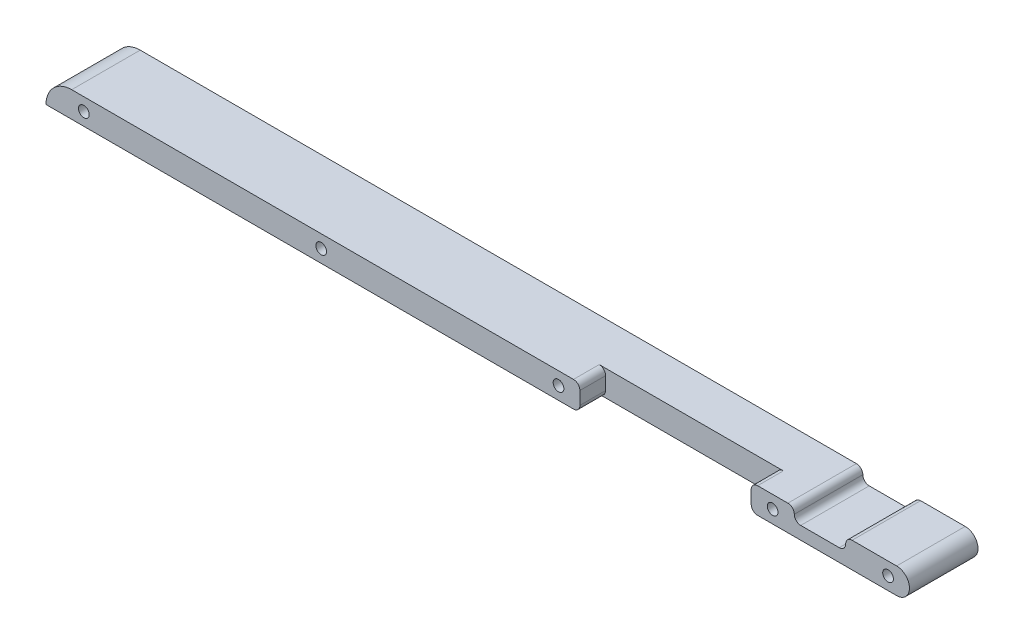
ISO-10303-21;
HEADER;
FILE_DESCRIPTION(('STEP AP214'),'2;1');
FILE_NAME('part.step','',(''),(''),'','','');
FILE_SCHEMA(('AUTOMOTIVE_DESIGN { 1 0 10303 214 1 1 1 1 }'));
ENDSEC;
DATA;
#1=APPLICATION_CONTEXT('core data for automotive mechanical design processes');
#2=APPLICATION_PROTOCOL_DEFINITION('international standard','automotive_design',2000,#1);
#3=PRODUCT_CONTEXT('',#1,'mechanical');
#4=PRODUCT('Part','Part','',(#3));
#5=PRODUCT_RELATED_PRODUCT_CATEGORY('part','',(#4));
#6=PRODUCT_DEFINITION_FORMATION('','',#4);
#7=PRODUCT_DEFINITION_CONTEXT('part definition',#1,'design');
#8=PRODUCT_DEFINITION('design','',#6,#7);
#9=PRODUCT_DEFINITION_SHAPE('','',#8);
#10=(LENGTH_UNIT() NAMED_UNIT(*) SI_UNIT(.MILLI.,.METRE.));
#11=(NAMED_UNIT(*) PLANE_ANGLE_UNIT() SI_UNIT($,.RADIAN.));
#12=(NAMED_UNIT(*) SI_UNIT($,.STERADIAN.) SOLID_ANGLE_UNIT());
#13=UNCERTAINTY_MEASURE_WITH_UNIT(LENGTH_MEASURE(1.E-05),#10,'distance_accuracy_value','');
#14=(GEOMETRIC_REPRESENTATION_CONTEXT(3) GLOBAL_UNCERTAINTY_ASSIGNED_CONTEXT((#13)) GLOBAL_UNIT_ASSIGNED_CONTEXT((#10,
#11,#12)) REPRESENTATION_CONTEXT('',''));
#15=CARTESIAN_POINT('',(0.,0.,0.));
#16=DIRECTION('',(0.,0.,1.));
#17=DIRECTION('',(1.,0.,0.));
#18=AXIS2_PLACEMENT_3D('',#15,#16,#17);
#19=CARTESIAN_POINT('',(99.3199999999999,1.50000000000007,8.));
#20=DIRECTION('',(0.,0.,-1.));
#21=DIRECTION('',(-1.,0.,0.));
#22=AXIS2_PLACEMENT_3D('',#19,#20,#21);
#23=CYLINDRICAL_SURFACE('',#22,1.50000000000007);
#24=DIRECTION('',(0.,0.,-1.));
#25=VECTOR('',#24,1.);
#26=CARTESIAN_POINT('',(99.3199999999999,3.00000000000014,8.));
#27=LINE('',#26,#25);
#28=CARTESIAN_POINT('',(99.3199999999999,3.00000000000014,8.));
#29=VERTEX_POINT('',#28);
#30=CARTESIAN_POINT('',(99.3199999999999,3.00000000000014,0.));
#31=VERTEX_POINT('',#30);
#32=EDGE_CURVE('E197',#29,#31,#27,.T.);
#33=ORIENTED_EDGE('',*,*,#32,.F.);
#34=CARTESIAN_POINT('',(99.3199999999999,1.50000000000007,8.));
#35=DIRECTION('',(0.,0.,1.));
#36=DIRECTION('',(1.,0.,0.));
#37=AXIS2_PLACEMENT_3D('',#34,#35,#36);
#38=CIRCLE('',#37,1.50000000000007);
#39=CARTESIAN_POINT('',(99.3199999999999,0.,8.));
#40=VERTEX_POINT('',#39);
#41=EDGE_CURVE('E212',#40,#29,#38,.T.);
#42=ORIENTED_EDGE('',*,*,#41,.F.);
#43=DIRECTION('',(0.,0.,-1.));
#44=VECTOR('',#43,1.);
#45=CARTESIAN_POINT('',(99.3199999999999,0.,8.));
#46=LINE('',#45,#44);
#47=CARTESIAN_POINT('',(99.3199999999999,0.,0.));
#48=VERTEX_POINT('',#47);
#49=EDGE_CURVE('E203',#48,#40,#46,.F.);
#50=ORIENTED_EDGE('',*,*,#49,.F.);
#51=CARTESIAN_POINT('',(99.3199999999999,1.50000000000007,0.));
#52=DIRECTION('',(0.,0.,1.));
#53=DIRECTION('',(1.,0.,0.));
#54=AXIS2_PLACEMENT_3D('',#51,#52,#53);
#55=CIRCLE('',#54,1.50000000000007);
#56=EDGE_CURVE('E215',#31,#48,#55,.F.);
#57=ORIENTED_EDGE('',*,*,#56,.F.);
#58=EDGE_LOOP('',(#33,#42,#50,#57));
#59=FACE_BOUND('',#58,.T.);
#60=ADVANCED_FACE('F43',(#59),#23,.T.);
#61=CARTESIAN_POINT('',(100.82,3.00000000000014,8.));
#62=DIRECTION('',(0.,-1.,0.));
#63=DIRECTION('',(1.,0.,0.));
#64=AXIS2_PLACEMENT_3D('',#61,#62,#63);
#65=PLANE('',#64);
#66=DIRECTION('',(-1.,0.,0.));
#67=VECTOR('',#66,1.);
#68=CARTESIAN_POINT('',(100.82,3.00000000000014,8.));
#69=LINE('',#68,#67);
#70=CARTESIAN_POINT('',(86.62,3.00000000000014,8.));
#71=VERTEX_POINT('',#70);
#72=CARTESIAN_POINT('',(83.09,3.00000000000014,8.));
#73=VERTEX_POINT('',#72);
#74=EDGE_CURVE('E331',#71,#73,#69,.T.);
#75=ORIENTED_EDGE('',*,*,#74,.F.);
#76=DIRECTION('',(0.,0.,1.));
#77=VECTOR('',#76,1.);
#78=CARTESIAN_POINT('',(86.62,3.00000000000014,8.));
#79=LINE('',#78,#77);
#80=CARTESIAN_POINT('',(86.62,3.00000000000014,0.));
#81=VERTEX_POINT('',#80);
#82=EDGE_CURVE('E279',#71,#81,#79,.F.);
#83=ORIENTED_EDGE('',*,*,#82,.T.);
#84=DIRECTION('',(-1.,0.,0.));
#85=VECTOR('',#84,1.);
#86=CARTESIAN_POINT('',(100.82,3.00000000000014,0.));
#87=LINE('',#86,#85);
#88=CARTESIAN_POINT('',(3.,3.00000000000013,0.));
#89=VERTEX_POINT('',#88);
#90=EDGE_CURVE('E346',#81,#89,#87,.T.);
#91=ORIENTED_EDGE('',*,*,#90,.T.);
#92=DIRECTION('',(0.,0.,-1.));
#93=VECTOR('',#92,1.);
#94=CARTESIAN_POINT('',(3.,3.00000000000013,8.));
#95=LINE('',#94,#93);
#96=CARTESIAN_POINT('',(3.,3.00000000000013,8.));
#97=VERTEX_POINT('',#96);
#98=EDGE_CURVE('E198',#97,#89,#95,.T.);
#99=ORIENTED_EDGE('',*,*,#98,.F.);
#100=CARTESIAN_POINT('',(61.59,3.00000000000014,8.));
#101=VERTEX_POINT('',#100);
#102=EDGE_CURVE('E180',#101,#97,#69,.T.);
#103=ORIENTED_EDGE('',*,*,#102,.F.);
#104=DIRECTION('',(0.,0.,1.));
#105=VECTOR('',#104,1.);
#106=CARTESIAN_POINT('',(61.59,3.00000000000014,8.));
#107=LINE('',#106,#105);
#108=CARTESIAN_POINT('',(61.59,3.00000000000015,5.));
#109=VERTEX_POINT('',#108);
#110=EDGE_CURVE('E273',#101,#109,#107,.F.);
#111=ORIENTED_EDGE('',*,*,#110,.T.);
#112=DIRECTION('',(-1.,0.,0.));
#113=VECTOR('',#112,1.);
#114=CARTESIAN_POINT('',(62.34,3.00000000000015,5.));
#115=LINE('',#114,#113);
#116=CARTESIAN_POINT('',(83.09,3.00000000000015,5.));
#117=VERTEX_POINT('',#116);
#118=EDGE_CURVE('E61',#117,#109,#115,.T.);
#119=ORIENTED_EDGE('',*,*,#118,.F.);
#120=DIRECTION('',(0.,0.,1.));
#121=VECTOR('',#120,1.);
#122=CARTESIAN_POINT('',(83.09,3.00000000000014,8.));
#123=LINE('',#122,#121);
#124=EDGE_CURVE('E276',#117,#73,#123,.T.);
#125=ORIENTED_EDGE('',*,*,#124,.T.);
#126=EDGE_LOOP('',(#75,#83,#91,#99,#103,#111,#119,#125));
#127=FACE_BOUND('',#126,.T.);
#128=ADVANCED_FACE('F333',(#127),#65,.F.);
#129=CARTESIAN_POINT('',(3.,1.32272665043232E-13,8.));
#130=DIRECTION('',(0.,0.,1.));
#131=DIRECTION('',(1.,0.,0.));
#132=AXIS2_PLACEMENT_3D('',#129,#130,#131);
#133=PLANE('',#132);
#134=CARTESIAN_POINT('',(4.42,1.50000000000007,8.));
#135=DIRECTION('',(0.,0.,1.));
#136=DIRECTION('',(1.,0.,0.));
#137=AXIS2_PLACEMENT_3D('',#134,#135,#136);
#138=CIRCLE('',#137,0.624999999999999);
#139=CARTESIAN_POINT('',(5.045,1.50000000000007,8.));
#140=VERTEX_POINT('',#139);
#141=EDGE_CURVE('E435',#140,#140,#138,.T.);
#142=ORIENTED_EDGE('',*,*,#141,.F.);
#143=EDGE_LOOP('',(#142));
#144=FACE_BOUND('',#143,.T.);
#145=CARTESIAN_POINT('',(59.84,1.50000000000007,8.));
#146=DIRECTION('',(0.,0.,1.));
#147=DIRECTION('',(1.,0.,0.));
#148=AXIS2_PLACEMENT_3D('',#145,#146,#147);
#149=CIRCLE('',#148,0.625000000000001);
#150=CARTESIAN_POINT('',(60.465,1.50000000000007,8.));
#151=VERTEX_POINT('',#150);
#152=EDGE_CURVE('E427',#151,#151,#149,.T.);
#153=ORIENTED_EDGE('',*,*,#152,.F.);
#154=EDGE_LOOP('',(#153));
#155=FACE_BOUND('',#154,.T.);
#156=CARTESIAN_POINT('',(32.13,1.50000000000007,8.));
#157=DIRECTION('',(0.,0.,1.));
#158=DIRECTION('',(1.,0.,0.));
#159=AXIS2_PLACEMENT_3D('',#156,#157,#158);
#160=CIRCLE('',#159,0.625000000000001);
#161=CARTESIAN_POINT('',(32.755,1.50000000000007,8.));
#162=VERTEX_POINT('',#161);
#163=EDGE_CURVE('E403',#162,#162,#160,.T.);
#164=ORIENTED_EDGE('',*,*,#163,.F.);
#165=EDGE_LOOP('',(#164));
#166=FACE_BOUND('',#165,.T.);
#167=DIRECTION('',(1.,0.,0.));
#168=VECTOR('',#167,1.);
#169=CARTESIAN_POINT('',(0.,0.,8.));
#170=LINE('',#169,#168);
#171=CARTESIAN_POINT('',(0.,0.,8.));
#172=VERTEX_POINT('',#171);
#173=CARTESIAN_POINT('',(61.59,0.,8.));
#174=VERTEX_POINT('',#173);
#175=EDGE_CURVE('E169',#172,#174,#170,.T.);
#176=ORIENTED_EDGE('',*,*,#175,.T.);
#177=CARTESIAN_POINT('',(61.59,0.75,8.));
#178=DIRECTION('',(0.,0.,1.));
#179=DIRECTION('',(1.,0.,0.));
#180=AXIS2_PLACEMENT_3D('',#177,#178,#179);
#181=CIRCLE('',#180,0.75);
#182=CARTESIAN_POINT('',(62.34,0.75,8.));
#183=VERTEX_POINT('',#182);
#184=EDGE_CURVE('E227',#174,#183,#181,.T.);
#185=ORIENTED_EDGE('',*,*,#184,.T.);
#186=DIRECTION('',(0.,-1.,0.));
#187=VECTOR('',#186,1.);
#188=CARTESIAN_POINT('',(62.34,3.00000000000015,8.));
#189=LINE('',#188,#187);
#190=CARTESIAN_POINT('',(62.34,2.25000000000014,8.));
#191=VERTEX_POINT('',#190);
#192=EDGE_CURVE('E389',#191,#183,#189,.T.);
#193=ORIENTED_EDGE('',*,*,#192,.F.);
#194=CARTESIAN_POINT('',(61.59,2.25000000000014,8.));
#195=DIRECTION('',(0.,0.,1.));
#196=DIRECTION('',(1.,0.,0.));
#197=AXIS2_PLACEMENT_3D('',#194,#195,#196);
#198=CIRCLE('',#197,0.75);
#199=EDGE_CURVE('E224',#191,#101,#198,.T.);
#200=ORIENTED_EDGE('',*,*,#199,.T.);
#201=ORIENTED_EDGE('',*,*,#102,.T.);
#202=CARTESIAN_POINT('',(3.,1.32272665043232E-13,8.));
#203=DIRECTION('',(0.,0.,1.));
#204=DIRECTION('',(1.,0.,0.));
#205=AXIS2_PLACEMENT_3D('',#202,#203,#204);
#206=CIRCLE('',#205,3.);
#207=EDGE_CURVE('E184',#97,#172,#206,.T.);
#208=ORIENTED_EDGE('',*,*,#207,.T.);
#209=EDGE_LOOP('',(#176,#185,#193,#200,#201,#208));
#210=FACE_BOUND('',#209,.T.);
#211=ADVANCED_FACE('F185',(#144,#155,#166,#210),#133,.T.);
#212=CARTESIAN_POINT('',(3.,1.32272665043232E-13,8.));
#213=DIRECTION('',(0.,0.,-1.));
#214=DIRECTION('',(-1.,0.,0.));
#215=AXIS2_PLACEMENT_3D('',#212,#213,#214);
#216=CYLINDRICAL_SURFACE('',#215,3.);
#217=CARTESIAN_POINT('',(3.,1.32272665043232E-13,0.));
#218=DIRECTION('',(0.,0.,1.));
#219=DIRECTION('',(1.,0.,0.));
#220=AXIS2_PLACEMENT_3D('',#217,#218,#219);
#221=CIRCLE('',#220,3.);
#222=CARTESIAN_POINT('',(0.,0.,0.));
#223=VERTEX_POINT('',#222);
#224=EDGE_CURVE('E195',#89,#223,#221,.T.);
#225=ORIENTED_EDGE('',*,*,#224,.T.);
#226=DIRECTION('',(0.,0.,-1.));
#227=VECTOR('',#226,1.);
#228=CARTESIAN_POINT('',(0.,0.,8.));
#229=LINE('',#228,#227);
#230=EDGE_CURVE('E174',#172,#223,#229,.T.);
#231=ORIENTED_EDGE('',*,*,#230,.F.);
#232=ORIENTED_EDGE('',*,*,#207,.F.);
#233=ORIENTED_EDGE('',*,*,#98,.T.);
#234=EDGE_LOOP('',(#225,#231,#232,#233));
#235=FACE_BOUND('',#234,.T.);
#236=ADVANCED_FACE('F193',(#235),#216,.T.);
#237=CARTESIAN_POINT('',(0.,0.,8.));
#238=DIRECTION('',(0.,1.,0.));
#239=DIRECTION('',(0.,0.,1.));
#240=AXIS2_PLACEMENT_3D('',#237,#238,#239);
#241=PLANE('',#240);
#242=DIRECTION('',(1.,0.,0.));
#243=VECTOR('',#242,1.);
#244=CARTESIAN_POINT('',(62.34,0.,5.));
#245=LINE('',#244,#243);
#246=CARTESIAN_POINT('',(61.59,0.,5.));
#247=VERTEX_POINT('',#246);
#248=CARTESIAN_POINT('',(83.09,0.,5.));
#249=VERTEX_POINT('',#248);
#250=EDGE_CURVE('E380',#247,#249,#245,.T.);
#251=ORIENTED_EDGE('',*,*,#250,.F.);
#252=DIRECTION('',(0.,0.,1.));
#253=VECTOR('',#252,1.);
#254=CARTESIAN_POINT('',(61.59,0.,8.));
#255=LINE('',#254,#253);
#256=EDGE_CURVE('E177',#247,#174,#255,.T.);
#257=ORIENTED_EDGE('',*,*,#256,.T.);
#258=ORIENTED_EDGE('',*,*,#175,.F.);
#259=ORIENTED_EDGE('',*,*,#230,.T.);
#260=DIRECTION('',(1.,0.,0.));
#261=VECTOR('',#260,1.);
#262=CARTESIAN_POINT('',(0.,0.,0.));
#263=LINE('',#262,#261);
#264=EDGE_CURVE('E344',#223,#48,#263,.T.);
#265=ORIENTED_EDGE('',*,*,#264,.T.);
#266=ORIENTED_EDGE('',*,*,#49,.T.);
#267=CARTESIAN_POINT('',(83.09,0.,8.));
#268=VERTEX_POINT('',#267);
#269=EDGE_CURVE('E181',#268,#40,#170,.T.);
#270=ORIENTED_EDGE('',*,*,#269,.F.);
#271=DIRECTION('',(0.,0.,1.));
#272=VECTOR('',#271,1.);
#273=CARTESIAN_POINT('',(83.09,0.,8.));
#274=LINE('',#273,#272);
#275=EDGE_CURVE('E218',#268,#249,#274,.F.);
#276=ORIENTED_EDGE('',*,*,#275,.T.);
#277=EDGE_LOOP('',(#251,#257,#258,#259,#265,#266,#270,#276));
#278=FACE_BOUND('',#277,.T.);
#279=ADVANCED_FACE('F171',(#278),#241,.F.);
#280=CARTESIAN_POINT('',(94.12,3.00000000000014,0.));
#281=VERTEX_POINT('',#280);
#282=EDGE_CURVE('E191',#31,#281,#87,.T.);
#283=ORIENTED_EDGE('',*,*,#282,.T.);
#284=DIRECTION('',(0.,0.,1.));
#285=VECTOR('',#284,1.);
#286=CARTESIAN_POINT('',(94.12,3.00000000000014,8.));
#287=LINE('',#286,#285);
#288=CARTESIAN_POINT('',(94.12,3.00000000000014,8.));
#289=VERTEX_POINT('',#288);
#290=EDGE_CURVE('E264',#281,#289,#287,.T.);
#291=ORIENTED_EDGE('',*,*,#290,.T.);
#292=EDGE_CURVE('E205',#29,#289,#69,.T.);
#293=ORIENTED_EDGE('',*,*,#292,.F.);
#294=ORIENTED_EDGE('',*,*,#32,.T.);
#295=EDGE_LOOP('',(#283,#291,#293,#294));
#296=FACE_BOUND('',#295,.T.);
#297=ADVANCED_FACE('F448',(#296),#65,.F.);
#298=DIRECTION('',(0.,1.,0.));
#299=VECTOR('',#298,1.);
#300=CARTESIAN_POINT('',(82.34,3.00000000000015,8.));
#301=LINE('',#300,#299);
#302=CARTESIAN_POINT('',(82.34,0.75,8.));
#303=VERTEX_POINT('',#302);
#304=CARTESIAN_POINT('',(82.34,2.25000000000014,8.));
#305=VERTEX_POINT('',#304);
#306=EDGE_CURVE('E367',#303,#305,#301,.T.);
#307=ORIENTED_EDGE('',*,*,#306,.F.);
#308=CARTESIAN_POINT('',(83.09,0.75,8.));
#309=DIRECTION('',(0.,0.,1.));
#310=DIRECTION('',(1.,0.,0.));
#311=AXIS2_PLACEMENT_3D('',#308,#309,#310);
#312=CIRCLE('',#311,0.75);
#313=EDGE_CURVE('E253',#303,#268,#312,.T.);
#314=ORIENTED_EDGE('',*,*,#313,.T.);
#315=ORIENTED_EDGE('',*,*,#269,.T.);
#316=ORIENTED_EDGE('',*,*,#41,.T.);
#317=ORIENTED_EDGE('',*,*,#292,.T.);
#318=CARTESIAN_POINT('',(94.12,2.25000000000014,8.));
#319=DIRECTION('',(0.,0.,1.));
#320=DIRECTION('',(1.,0.,0.));
#321=AXIS2_PLACEMENT_3D('',#318,#319,#320);
#322=CIRCLE('',#321,0.75);
#323=CARTESIAN_POINT('',(93.37,2.25000000000014,8.));
#324=VERTEX_POINT('',#323);
#325=EDGE_CURVE('E250',#289,#324,#322,.T.);
#326=ORIENTED_EDGE('',*,*,#325,.T.);
#327=CARTESIAN_POINT('',(92.62,2.25000000000007,8.));
#328=DIRECTION('',(0.,0.,1.));
#329=DIRECTION('',(1.,0.,0.));
#330=AXIS2_PLACEMENT_3D('',#327,#328,#329);
#331=CIRCLE('',#330,0.75);
#332=CARTESIAN_POINT('',(92.62,1.50000000000007,8.));
#333=VERTEX_POINT('',#332);
#334=EDGE_CURVE('E289',#324,#333,#331,.F.);
#335=ORIENTED_EDGE('',*,*,#334,.T.);
#336=DIRECTION('',(1.,0.,0.));
#337=VECTOR('',#336,1.);
#338=CARTESIAN_POINT('',(87.37,1.50000000000007,8.));
#339=LINE('',#338,#337);
#340=CARTESIAN_POINT('',(88.12,1.50000000000007,8.));
#341=VERTEX_POINT('',#340);
#342=EDGE_CURVE('E305',#341,#333,#339,.T.);
#343=ORIENTED_EDGE('',*,*,#342,.F.);
#344=CARTESIAN_POINT('',(88.12,2.25000000000007,8.));
#345=DIRECTION('',(0.,0.,1.));
#346=DIRECTION('',(1.,0.,0.));
#347=AXIS2_PLACEMENT_3D('',#344,#345,#346);
#348=CIRCLE('',#347,0.75);
#349=CARTESIAN_POINT('',(87.37,2.25000000000014,8.));
#350=VERTEX_POINT('',#349);
#351=EDGE_CURVE('E295',#341,#350,#348,.F.);
#352=ORIENTED_EDGE('',*,*,#351,.T.);
#353=CARTESIAN_POINT('',(86.62,2.25000000000014,8.));
#354=DIRECTION('',(0.,0.,1.));
#355=DIRECTION('',(1.,0.,0.));
#356=AXIS2_PLACEMENT_3D('',#353,#354,#355);
#357=CIRCLE('',#356,0.75);
#358=EDGE_CURVE('E247',#350,#71,#357,.T.);
#359=ORIENTED_EDGE('',*,*,#358,.T.);
#360=ORIENTED_EDGE('',*,*,#74,.T.);
#361=CARTESIAN_POINT('',(83.09,2.25000000000014,8.));
#362=DIRECTION('',(0.,0.,1.));
#363=DIRECTION('',(1.,0.,0.));
#364=AXIS2_PLACEMENT_3D('',#361,#362,#363);
#365=CIRCLE('',#364,0.75);
#366=EDGE_CURVE('E244',#73,#305,#365,.T.);
#367=ORIENTED_EDGE('',*,*,#366,.T.);
#368=EDGE_LOOP('',(#307,#314,#315,#316,#317,#326,#335,#343,#352,#359,#360,#367));
#369=FACE_BOUND('',#368,.T.);
#370=CARTESIAN_POINT('',(84.84,1.50000000000007,8.));
#371=DIRECTION('',(0.,0.,1.));
#372=DIRECTION('',(1.,0.,0.));
#373=AXIS2_PLACEMENT_3D('',#370,#371,#372);
#374=CIRCLE('',#373,0.625000000000001);
#375=CARTESIAN_POINT('',(85.465,1.50000000000007,8.));
#376=VERTEX_POINT('',#375);
#377=EDGE_CURVE('E419',#376,#376,#374,.T.);
#378=ORIENTED_EDGE('',*,*,#377,.F.);
#379=EDGE_LOOP('',(#378));
#380=FACE_BOUND('',#379,.T.);
#381=CARTESIAN_POINT('',(98.32,1.50000000000007,8.));
#382=DIRECTION('',(0.,0.,1.));
#383=DIRECTION('',(1.,0.,0.));
#384=AXIS2_PLACEMENT_3D('',#381,#382,#383);
#385=CIRCLE('',#384,0.625000000000001);
#386=CARTESIAN_POINT('',(98.945,1.50000000000007,8.));
#387=VERTEX_POINT('',#386);
#388=EDGE_CURVE('E411',#387,#387,#385,.T.);
#389=ORIENTED_EDGE('',*,*,#388,.F.);
#390=EDGE_LOOP('',(#389));
#391=FACE_BOUND('',#390,.T.);
#392=ADVANCED_FACE('F329',(#369,#380,#391),#133,.T.);
#393=CARTESIAN_POINT('',(3.,1.32272665043232E-13,0.));
#394=DIRECTION('',(0.,0.,1.));
#395=DIRECTION('',(1.,0.,0.));
#396=AXIS2_PLACEMENT_3D('',#393,#394,#395);
#397=PLANE('',#396);
#398=DIRECTION('',(1.,0.,0.));
#399=VECTOR('',#398,1.);
#400=CARTESIAN_POINT('',(87.37,1.50000000000007,0.));
#401=LINE('',#400,#399);
#402=CARTESIAN_POINT('',(88.12,1.50000000000007,0.));
#403=VERTEX_POINT('',#402);
#404=CARTESIAN_POINT('',(92.62,1.50000000000007,0.));
#405=VERTEX_POINT('',#404);
#406=EDGE_CURVE('E312',#403,#405,#401,.T.);
#407=ORIENTED_EDGE('',*,*,#406,.T.);
#408=CARTESIAN_POINT('',(92.62,2.25000000000007,0.));
#409=DIRECTION('',(0.,0.,1.));
#410=DIRECTION('',(1.,0.,0.));
#411=AXIS2_PLACEMENT_3D('',#408,#409,#410);
#412=CIRCLE('',#411,0.75);
#413=CARTESIAN_POINT('',(93.37,2.25000000000014,0.));
#414=VERTEX_POINT('',#413);
#415=EDGE_CURVE('E292',#405,#414,#412,.T.);
#416=ORIENTED_EDGE('',*,*,#415,.T.);
#417=CARTESIAN_POINT('',(94.12,2.25000000000014,0.));
#418=DIRECTION('',(0.,0.,1.));
#419=DIRECTION('',(1.,0.,0.));
#420=AXIS2_PLACEMENT_3D('',#417,#418,#419);
#421=CIRCLE('',#420,0.75);
#422=EDGE_CURVE('E270',#414,#281,#421,.F.);
#423=ORIENTED_EDGE('',*,*,#422,.T.);
#424=ORIENTED_EDGE('',*,*,#282,.F.);
#425=ORIENTED_EDGE('',*,*,#56,.T.);
#426=ORIENTED_EDGE('',*,*,#264,.F.);
#427=ORIENTED_EDGE('',*,*,#224,.F.);
#428=ORIENTED_EDGE('',*,*,#90,.F.);
#429=CARTESIAN_POINT('',(86.62,2.25000000000014,0.));
#430=DIRECTION('',(0.,0.,1.));
#431=DIRECTION('',(1.,0.,0.));
#432=AXIS2_PLACEMENT_3D('',#429,#430,#431);
#433=CIRCLE('',#432,0.75);
#434=CARTESIAN_POINT('',(87.37,2.25000000000014,0.));
#435=VERTEX_POINT('',#434);
#436=EDGE_CURVE('E267',#81,#435,#433,.F.);
#437=ORIENTED_EDGE('',*,*,#436,.T.);
#438=CARTESIAN_POINT('',(88.12,2.25000000000007,0.));
#439=DIRECTION('',(0.,0.,1.));
#440=DIRECTION('',(1.,0.,0.));
#441=AXIS2_PLACEMENT_3D('',#438,#439,#440);
#442=CIRCLE('',#441,0.75);
#443=EDGE_CURVE('E298',#435,#403,#442,.T.);
#444=ORIENTED_EDGE('',*,*,#443,.T.);
#445=EDGE_LOOP('',(#407,#416,#423,#424,#425,#426,#427,#428,#437,#444));
#446=FACE_BOUND('',#445,.T.);
#447=CARTESIAN_POINT('',(4.42,1.50000000000007,0.));
#448=DIRECTION('',(0.,0.,1.));
#449=DIRECTION('',(1.,0.,0.));
#450=AXIS2_PLACEMENT_3D('',#447,#448,#449);
#451=CIRCLE('',#450,0.624999999999998);
#452=CARTESIAN_POINT('',(5.045,1.50000000000007,0.));
#453=VERTEX_POINT('',#452);
#454=EDGE_CURVE('E431',#453,#453,#451,.T.);
#455=ORIENTED_EDGE('',*,*,#454,.T.);
#456=EDGE_LOOP('',(#455));
#457=FACE_BOUND('',#456,.T.);
#458=CARTESIAN_POINT('',(59.84,1.50000000000007,0.));
#459=DIRECTION('',(0.,0.,1.));
#460=DIRECTION('',(1.,0.,0.));
#461=AXIS2_PLACEMENT_3D('',#458,#459,#460);
#462=CIRCLE('',#461,0.625000000000001);
#463=CARTESIAN_POINT('',(60.465,1.50000000000007,0.));
#464=VERTEX_POINT('',#463);
#465=EDGE_CURVE('E423',#464,#464,#462,.T.);
#466=ORIENTED_EDGE('',*,*,#465,.T.);
#467=EDGE_LOOP('',(#466));
#468=FACE_BOUND('',#467,.T.);
#469=CARTESIAN_POINT('',(84.84,1.50000000000007,0.));
#470=DIRECTION('',(0.,0.,1.));
#471=DIRECTION('',(1.,0.,0.));
#472=AXIS2_PLACEMENT_3D('',#469,#470,#471);
#473=CIRCLE('',#472,0.625000000000001);
#474=CARTESIAN_POINT('',(85.465,1.50000000000007,0.));
#475=VERTEX_POINT('',#474);
#476=EDGE_CURVE('E415',#475,#475,#473,.T.);
#477=ORIENTED_EDGE('',*,*,#476,.T.);
#478=EDGE_LOOP('',(#477));
#479=FACE_BOUND('',#478,.T.);
#480=CARTESIAN_POINT('',(98.32,1.50000000000007,0.));
#481=DIRECTION('',(0.,0.,1.));
#482=DIRECTION('',(1.,0.,0.));
#483=AXIS2_PLACEMENT_3D('',#480,#481,#482);
#484=CIRCLE('',#483,0.625000000000001);
#485=CARTESIAN_POINT('',(98.945,1.50000000000007,0.));
#486=VERTEX_POINT('',#485);
#487=EDGE_CURVE('E407',#486,#486,#484,.T.);
#488=ORIENTED_EDGE('',*,*,#487,.T.);
#489=EDGE_LOOP('',(#488));
#490=FACE_BOUND('',#489,.T.);
#491=CARTESIAN_POINT('',(32.13,1.50000000000007,0.));
#492=DIRECTION('',(0.,0.,1.));
#493=DIRECTION('',(1.,0.,0.));
#494=AXIS2_PLACEMENT_3D('',#491,#492,#493);
#495=CIRCLE('',#494,0.625000000000001);
#496=CARTESIAN_POINT('',(32.755,1.50000000000007,0.));
#497=VERTEX_POINT('',#496);
#498=EDGE_CURVE('E393',#497,#497,#495,.T.);
#499=ORIENTED_EDGE('',*,*,#498,.T.);
#500=EDGE_LOOP('',(#499));
#501=FACE_BOUND('',#500,.T.);
#502=ADVANCED_FACE('F355',(#446,#457,#468,#479,#490,#501),#397,.F.);
#503=CARTESIAN_POINT('',(62.34,3.00000000000015,5.));
#504=DIRECTION('',(-1.,0.,0.));
#505=DIRECTION('',(0.,0.,1.));
#506=AXIS2_PLACEMENT_3D('',#503,#504,#505);
#507=PLANE('',#506);
#508=ORIENTED_EDGE('',*,*,#192,.T.);
#509=DIRECTION('',(0.,0.,1.));
#510=VECTOR('',#509,1.);
#511=CARTESIAN_POINT('',(62.34,0.75,5.));
#512=LINE('',#511,#510);
#513=CARTESIAN_POINT('',(62.34,0.75,5.));
#514=VERTEX_POINT('',#513);
#515=EDGE_CURVE('E234',#183,#514,#512,.F.);
#516=ORIENTED_EDGE('',*,*,#515,.T.);
#517=DIRECTION('',(0.,-1.,0.));
#518=VECTOR('',#517,1.);
#519=CARTESIAN_POINT('',(62.34,3.00000000000015,5.));
#520=LINE('',#519,#518);
#521=CARTESIAN_POINT('',(62.34,2.25000000000014,5.));
#522=VERTEX_POINT('',#521);
#523=EDGE_CURVE('E385',#522,#514,#520,.T.);
#524=ORIENTED_EDGE('',*,*,#523,.F.);
#525=DIRECTION('',(0.,0.,1.));
#526=VECTOR('',#525,1.);
#527=CARTESIAN_POINT('',(62.34,2.25000000000014,5.));
#528=LINE('',#527,#526);
#529=EDGE_CURVE('E230',#522,#191,#528,.T.);
#530=ORIENTED_EDGE('',*,*,#529,.T.);
#531=EDGE_LOOP('',(#508,#516,#524,#530));
#532=FACE_BOUND('',#531,.T.);
#533=ADVANCED_FACE('F499',(#532),#507,.F.);
#534=CARTESIAN_POINT('',(82.34,3.00000000000015,5.));
#535=DIRECTION('',(1.,0.,0.));
#536=DIRECTION('',(0.,0.,-1.));
#537=AXIS2_PLACEMENT_3D('',#534,#535,#536);
#538=PLANE('',#537);
#539=DIRECTION('',(0.,1.,0.));
#540=VECTOR('',#539,1.);
#541=CARTESIAN_POINT('',(82.34,3.00000000000015,5.));
#542=LINE('',#541,#540);
#543=CARTESIAN_POINT('',(82.34,0.75,5.));
#544=VERTEX_POINT('',#543);
#545=CARTESIAN_POINT('',(82.34,2.25000000000014,5.));
#546=VERTEX_POINT('',#545);
#547=EDGE_CURVE('E377',#544,#546,#542,.T.);
#548=ORIENTED_EDGE('',*,*,#547,.F.);
#549=DIRECTION('',(0.,0.,1.));
#550=VECTOR('',#549,1.);
#551=CARTESIAN_POINT('',(82.34,0.75,5.));
#552=LINE('',#551,#550);
#553=EDGE_CURVE('E240',#544,#303,#552,.T.);
#554=ORIENTED_EDGE('',*,*,#553,.T.);
#555=ORIENTED_EDGE('',*,*,#306,.T.);
#556=DIRECTION('',(0.,0.,1.));
#557=VECTOR('',#556,1.);
#558=CARTESIAN_POINT('',(82.34,2.25000000000014,5.));
#559=LINE('',#558,#557);
#560=EDGE_CURVE('E237',#305,#546,#559,.F.);
#561=ORIENTED_EDGE('',*,*,#560,.T.);
#562=EDGE_LOOP('',(#548,#554,#555,#561));
#563=FACE_BOUND('',#562,.T.);
#564=ADVANCED_FACE('F374',(#563),#538,.F.);
#565=CARTESIAN_POINT('',(0.,0.,5.));
#566=DIRECTION('',(0.,0.,1.));
#567=DIRECTION('',(1.,0.,0.));
#568=AXIS2_PLACEMENT_3D('',#565,#566,#567);
#569=PLANE('',#568);
#570=ORIENTED_EDGE('',*,*,#118,.T.);
#571=CARTESIAN_POINT('',(61.59,2.25000000000014,5.));
#572=DIRECTION('',(0.,0.,1.));
#573=DIRECTION('',(1.,0.,0.));
#574=AXIS2_PLACEMENT_3D('',#571,#572,#573);
#575=CIRCLE('',#574,0.75);
#576=EDGE_CURVE('E11',#109,#522,#575,.F.);
#577=ORIENTED_EDGE('',*,*,#576,.T.);
#578=ORIENTED_EDGE('',*,*,#523,.T.);
#579=CARTESIAN_POINT('',(61.59,0.75,5.));
#580=DIRECTION('',(0.,0.,1.));
#581=DIRECTION('',(1.,0.,0.));
#582=AXIS2_PLACEMENT_3D('',#579,#580,#581);
#583=CIRCLE('',#582,0.75);
#584=EDGE_CURVE('E282',#514,#247,#583,.F.);
#585=ORIENTED_EDGE('',*,*,#584,.T.);
#586=ORIENTED_EDGE('',*,*,#250,.T.);
#587=CARTESIAN_POINT('',(83.09,0.75,5.));
#588=DIRECTION('',(0.,0.,1.));
#589=DIRECTION('',(1.,0.,0.));
#590=AXIS2_PLACEMENT_3D('',#587,#588,#589);
#591=CIRCLE('',#590,0.75);
#592=EDGE_CURVE('E286',#249,#544,#591,.F.);
#593=ORIENTED_EDGE('',*,*,#592,.T.);
#594=ORIENTED_EDGE('',*,*,#547,.T.);
#595=CARTESIAN_POINT('',(83.09,2.25000000000014,5.));
#596=DIRECTION('',(0.,0.,1.));
#597=DIRECTION('',(1.,0.,0.));
#598=AXIS2_PLACEMENT_3D('',#595,#596,#597);
#599=CIRCLE('',#598,0.75);
#600=EDGE_CURVE('E53',#546,#117,#599,.F.);
#601=ORIENTED_EDGE('',*,*,#600,.T.);
#602=EDGE_LOOP('',(#570,#577,#578,#585,#586,#593,#594,#601));
#603=FACE_BOUND('',#602,.T.);
#604=ADVANCED_FACE('F488',(#603),#569,.T.);
#605=CARTESIAN_POINT('',(32.13,1.50000000000007,8.));
#606=DIRECTION('',(0.,0.,1.));
#607=DIRECTION('',(1.,0.,0.));
#608=AXIS2_PLACEMENT_3D('',#605,#606,#607);
#609=CYLINDRICAL_SURFACE('',#608,0.625000000000001);
#610=ORIENTED_EDGE('',*,*,#498,.F.);
#611=EDGE_LOOP('',(#610));
#612=FACE_BOUND('',#611,.T.);
#613=ORIENTED_EDGE('',*,*,#163,.T.);
#614=EDGE_LOOP('',(#613));
#615=FACE_BOUND('',#614,.T.);
#616=ADVANCED_FACE('F490',(#612,#615),#609,.F.);
#617=CARTESIAN_POINT('',(98.32,1.50000000000007,8.));
#618=DIRECTION('',(0.,0.,1.));
#619=DIRECTION('',(1.,0.,0.));
#620=AXIS2_PLACEMENT_3D('',#617,#618,#619);
#621=CYLINDRICAL_SURFACE('',#620,0.625000000000001);
#622=ORIENTED_EDGE('',*,*,#487,.F.);
#623=EDGE_LOOP('',(#622));
#624=FACE_BOUND('',#623,.T.);
#625=ORIENTED_EDGE('',*,*,#388,.T.);
#626=EDGE_LOOP('',(#625));
#627=FACE_BOUND('',#626,.T.);
#628=ADVANCED_FACE('F496',(#624,#627),#621,.F.);
#629=CARTESIAN_POINT('',(84.84,1.50000000000007,8.));
#630=DIRECTION('',(0.,0.,1.));
#631=DIRECTION('',(1.,0.,0.));
#632=AXIS2_PLACEMENT_3D('',#629,#630,#631);
#633=CYLINDRICAL_SURFACE('',#632,0.625000000000001);
#634=ORIENTED_EDGE('',*,*,#476,.F.);
#635=EDGE_LOOP('',(#634));
#636=FACE_BOUND('',#635,.T.);
#637=ORIENTED_EDGE('',*,*,#377,.T.);
#638=EDGE_LOOP('',(#637));
#639=FACE_BOUND('',#638,.T.);
#640=ADVANCED_FACE('F641',(#636,#639),#633,.F.);
#641=CARTESIAN_POINT('',(59.84,1.50000000000007,8.));
#642=DIRECTION('',(0.,0.,1.));
#643=DIRECTION('',(1.,0.,0.));
#644=AXIS2_PLACEMENT_3D('',#641,#642,#643);
#645=CYLINDRICAL_SURFACE('',#644,0.625000000000001);
#646=ORIENTED_EDGE('',*,*,#465,.F.);
#647=EDGE_LOOP('',(#646));
#648=FACE_BOUND('',#647,.T.);
#649=ORIENTED_EDGE('',*,*,#152,.T.);
#650=EDGE_LOOP('',(#649));
#651=FACE_BOUND('',#650,.T.);
#652=ADVANCED_FACE('F650',(#648,#651),#645,.F.);
#653=CARTESIAN_POINT('',(4.42,1.50000000000007,8.));
#654=DIRECTION('',(0.,0.,1.));
#655=DIRECTION('',(1.,0.,0.));
#656=AXIS2_PLACEMENT_3D('',#653,#654,#655);
#657=CYLINDRICAL_SURFACE('',#656,0.624999999999998);
#658=ORIENTED_EDGE('',*,*,#454,.F.);
#659=EDGE_LOOP('',(#658));
#660=FACE_BOUND('',#659,.T.);
#661=ORIENTED_EDGE('',*,*,#141,.T.);
#662=EDGE_LOOP('',(#661));
#663=FACE_BOUND('',#662,.T.);
#664=ADVANCED_FACE('F532',(#660,#663),#657,.F.);
#665=CARTESIAN_POINT('',(87.37,1.50000000000007,0.));
#666=DIRECTION('',(0.,-1.,0.));
#667=DIRECTION('',(1.,0.,0.));
#668=AXIS2_PLACEMENT_3D('',#665,#666,#667);
#669=PLANE('',#668);
#670=ORIENTED_EDGE('',*,*,#342,.T.);
#671=DIRECTION('',(0.,0.,1.));
#672=VECTOR('',#671,1.);
#673=CARTESIAN_POINT('',(92.62,1.50000000000007,0.));
#674=LINE('',#673,#672);
#675=EDGE_CURVE('E260',#333,#405,#674,.F.);
#676=ORIENTED_EDGE('',*,*,#675,.T.);
#677=ORIENTED_EDGE('',*,*,#406,.F.);
#678=DIRECTION('',(0.,0.,1.));
#679=VECTOR('',#678,1.);
#680=CARTESIAN_POINT('',(88.12,1.50000000000007,8.));
#681=LINE('',#680,#679);
#682=EDGE_CURVE('E256',#403,#341,#681,.T.);
#683=ORIENTED_EDGE('',*,*,#682,.T.);
#684=EDGE_LOOP('',(#670,#676,#677,#683));
#685=FACE_BOUND('',#684,.T.);
#686=ADVANCED_FACE('F443',(#685),#669,.F.);
#687=CARTESIAN_POINT('',(61.59,0.75,8.));
#688=DIRECTION('',(0.,0.,1.));
#689=DIRECTION('',(1.,0.,0.));
#690=AXIS2_PLACEMENT_3D('',#687,#688,#689);
#691=CYLINDRICAL_SURFACE('',#690,0.75);
#692=ORIENTED_EDGE('',*,*,#584,.F.);
#693=ORIENTED_EDGE('',*,*,#515,.F.);
#694=ORIENTED_EDGE('',*,*,#184,.F.);
#695=ORIENTED_EDGE('',*,*,#256,.F.);
#696=EDGE_LOOP('',(#692,#693,#694,#695));
#697=FACE_BOUND('',#696,.T.);
#698=ADVANCED_FACE('F468',(#697),#691,.T.);
#699=CARTESIAN_POINT('',(83.09,0.75,5.));
#700=DIRECTION('',(0.,0.,1.));
#701=DIRECTION('',(1.,0.,0.));
#702=AXIS2_PLACEMENT_3D('',#699,#700,#701);
#703=CYLINDRICAL_SURFACE('',#702,0.75);
#704=ORIENTED_EDGE('',*,*,#592,.F.);
#705=ORIENTED_EDGE('',*,*,#275,.F.);
#706=ORIENTED_EDGE('',*,*,#313,.F.);
#707=ORIENTED_EDGE('',*,*,#553,.F.);
#708=EDGE_LOOP('',(#704,#705,#706,#707));
#709=FACE_BOUND('',#708,.T.);
#710=ADVANCED_FACE('F371',(#709),#703,.T.);
#711=CARTESIAN_POINT('',(94.12,2.25000000000014,8.));
#712=DIRECTION('',(0.,0.,1.));
#713=DIRECTION('',(1.,0.,0.));
#714=AXIS2_PLACEMENT_3D('',#711,#712,#713);
#715=CYLINDRICAL_SURFACE('',#714,0.75);
#716=ORIENTED_EDGE('',*,*,#290,.F.);
#717=ORIENTED_EDGE('',*,*,#422,.F.);
#718=DIRECTION('',(0.,0.,1.));
#719=VECTOR('',#718,1.);
#720=CARTESIAN_POINT('',(93.37,2.25000000000014,0.));
#721=LINE('',#720,#719);
#722=EDGE_CURVE('E302',#324,#414,#721,.F.);
#723=ORIENTED_EDGE('',*,*,#722,.F.);
#724=ORIENTED_EDGE('',*,*,#325,.F.);
#725=EDGE_LOOP('',(#716,#717,#723,#724));
#726=FACE_BOUND('',#725,.T.);
#727=ADVANCED_FACE('F447',(#726),#715,.T.);
#728=CARTESIAN_POINT('',(92.62,2.25000000000007,0.));
#729=DIRECTION('',(0.,0.,-1.));
#730=DIRECTION('',(-1.,0.,0.));
#731=AXIS2_PLACEMENT_3D('',#728,#729,#730);
#732=CYLINDRICAL_SURFACE('',#731,0.75);
#733=ORIENTED_EDGE('',*,*,#415,.F.);
#734=ORIENTED_EDGE('',*,*,#675,.F.);
#735=ORIENTED_EDGE('',*,*,#334,.F.);
#736=ORIENTED_EDGE('',*,*,#722,.T.);
#737=EDGE_LOOP('',(#733,#734,#735,#736));
#738=FACE_BOUND('',#737,.T.);
#739=ADVANCED_FACE('F445',(#738),#732,.F.);
#740=CARTESIAN_POINT('',(86.62,2.25000000000014,0.));
#741=DIRECTION('',(0.,0.,1.));
#742=DIRECTION('',(1.,0.,0.));
#743=AXIS2_PLACEMENT_3D('',#740,#741,#742);
#744=CYLINDRICAL_SURFACE('',#743,0.75);
#745=DIRECTION('',(0.,0.,1.));
#746=VECTOR('',#745,1.);
#747=CARTESIAN_POINT('',(87.37,2.25000000000014,0.));
#748=LINE('',#747,#746);
#749=EDGE_CURVE('E47',#435,#350,#748,.T.);
#750=ORIENTED_EDGE('',*,*,#749,.F.);
#751=ORIENTED_EDGE('',*,*,#436,.F.);
#752=ORIENTED_EDGE('',*,*,#82,.F.);
#753=ORIENTED_EDGE('',*,*,#358,.F.);
#754=EDGE_LOOP('',(#750,#751,#752,#753));
#755=FACE_BOUND('',#754,.T.);
#756=ADVANCED_FACE('F323',(#755),#744,.T.);
#757=CARTESIAN_POINT('',(88.12,2.25000000000007,0.));
#758=DIRECTION('',(0.,0.,-1.));
#759=DIRECTION('',(-1.,0.,0.));
#760=AXIS2_PLACEMENT_3D('',#757,#758,#759);
#761=CYLINDRICAL_SURFACE('',#760,0.75);
#762=ORIENTED_EDGE('',*,*,#443,.F.);
#763=ORIENTED_EDGE('',*,*,#749,.T.);
#764=ORIENTED_EDGE('',*,*,#351,.F.);
#765=ORIENTED_EDGE('',*,*,#682,.F.);
#766=EDGE_LOOP('',(#762,#763,#764,#765));
#767=FACE_BOUND('',#766,.T.);
#768=ADVANCED_FACE('F318',(#767),#761,.F.);
#769=CARTESIAN_POINT('',(83.09,2.25000000000014,8.));
#770=DIRECTION('',(0.,0.,1.));
#771=DIRECTION('',(1.,0.,0.));
#772=AXIS2_PLACEMENT_3D('',#769,#770,#771);
#773=CYLINDRICAL_SURFACE('',#772,0.75);
#774=ORIENTED_EDGE('',*,*,#600,.F.);
#775=ORIENTED_EDGE('',*,*,#560,.F.);
#776=ORIENTED_EDGE('',*,*,#366,.F.);
#777=ORIENTED_EDGE('',*,*,#124,.F.);
#778=EDGE_LOOP('',(#774,#775,#776,#777));
#779=FACE_BOUND('',#778,.T.);
#780=ADVANCED_FACE('F480',(#779),#773,.T.);
#781=CARTESIAN_POINT('',(61.59,2.25000000000014,5.));
#782=DIRECTION('',(0.,0.,1.));
#783=DIRECTION('',(1.,0.,0.));
#784=AXIS2_PLACEMENT_3D('',#781,#782,#783);
#785=CYLINDRICAL_SURFACE('',#784,0.75);
#786=ORIENTED_EDGE('',*,*,#576,.F.);
#787=ORIENTED_EDGE('',*,*,#110,.F.);
#788=ORIENTED_EDGE('',*,*,#199,.F.);
#789=ORIENTED_EDGE('',*,*,#529,.F.);
#790=EDGE_LOOP('',(#786,#787,#788,#789));
#791=FACE_BOUND('',#790,.T.);
#792=ADVANCED_FACE('F45',(#791),#785,.T.);
#793=CLOSED_SHELL('',(#60,#128,#211,#236,#279,#297,#392,#502,#533,#564,#604,#616,#628,#640,#652,
#664,#686,#698,#710,#727,#739,#756,#768,#780,#792));
#794=MANIFOLD_SOLID_BREP('B2',#793);
#795=ADVANCED_BREP_SHAPE_REPRESENTATION('',(#18,#794),#14);
#796=SHAPE_DEFINITION_REPRESENTATION(#9,#795);
ENDSEC;
END-ISO-10303-21;
